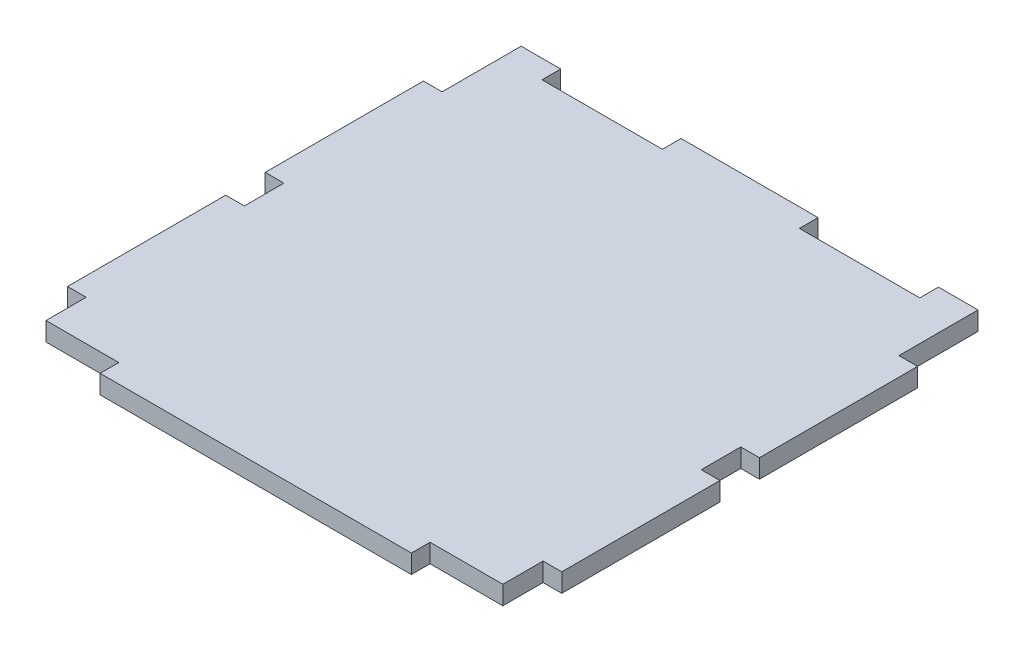
ISO-10303-21;
HEADER;
FILE_DESCRIPTION(('STEP AP214'),'2;1');
FILE_NAME('part.step','',(''),(''),'','','');
FILE_SCHEMA(('AUTOMOTIVE_DESIGN { 1 0 10303 214 1 1 1 1 }'));
ENDSEC;
DATA;
#1=APPLICATION_CONTEXT('core data for automotive mechanical design processes');
#2=APPLICATION_PROTOCOL_DEFINITION('international standard','automotive_design',2000,#1);
#3=PRODUCT_CONTEXT('',#1,'mechanical');
#4=PRODUCT('Part','Part','',(#3));
#5=PRODUCT_RELATED_PRODUCT_CATEGORY('part','',(#4));
#6=PRODUCT_DEFINITION_FORMATION('','',#4);
#7=PRODUCT_DEFINITION_CONTEXT('part definition',#1,'design');
#8=PRODUCT_DEFINITION('design','',#6,#7);
#9=PRODUCT_DEFINITION_SHAPE('','',#8);
#10=(LENGTH_UNIT() NAMED_UNIT(*) SI_UNIT(.MILLI.,.METRE.));
#11=(NAMED_UNIT(*) PLANE_ANGLE_UNIT() SI_UNIT($,.RADIAN.));
#12=(NAMED_UNIT(*) SI_UNIT($,.STERADIAN.) SOLID_ANGLE_UNIT());
#13=UNCERTAINTY_MEASURE_WITH_UNIT(LENGTH_MEASURE(1.E-05),#10,'distance_accuracy_value','');
#14=(GEOMETRIC_REPRESENTATION_CONTEXT(3) GLOBAL_UNCERTAINTY_ASSIGNED_CONTEXT((#13)) GLOBAL_UNIT_ASSIGNED_CONTEXT((#10,
#11,#12)) REPRESENTATION_CONTEXT('',''));
#15=CARTESIAN_POINT('',(0.,0.,0.));
#16=DIRECTION('',(0.,0.,1.));
#17=DIRECTION('',(1.,0.,0.));
#18=AXIS2_PLACEMENT_3D('',#15,#16,#17);
#19=CARTESIAN_POINT('',(0.,3.,35.155));
#20=DIRECTION('',(0.,0.,1.));
#21=DIRECTION('',(1.,0.,0.));
#22=AXIS2_PLACEMENT_3D('',#19,#20,#21);
#23=PLANE('',#22);
#24=DIRECTION('',(-1.,0.,0.));
#25=VECTOR('',#24,1.);
#26=CARTESIAN_POINT('',(0.,0.,35.155));
#27=LINE('',#26,#25);
#28=CARTESIAN_POINT('',(36.685,0.,35.155));
#29=VERTEX_POINT('',#28);
#30=CARTESIAN_POINT('',(24.995,0.,35.155));
#31=VERTEX_POINT('',#30);
#32=EDGE_CURVE('E271',#29,#31,#27,.T.);
#33=ORIENTED_EDGE('',*,*,#32,.F.);
#34=DIRECTION('',(0.,-1.,0.));
#35=VECTOR('',#34,1.);
#36=CARTESIAN_POINT('',(36.685,3.,35.155));
#37=LINE('',#36,#35);
#38=CARTESIAN_POINT('',(36.685,3.,35.155));
#39=VERTEX_POINT('',#38);
#40=EDGE_CURVE('E11',#39,#29,#37,.T.);
#41=ORIENTED_EDGE('',*,*,#40,.F.);
#42=DIRECTION('',(-1.,0.,0.));
#43=VECTOR('',#42,1.);
#44=CARTESIAN_POINT('',(0.,3.,35.155));
#45=LINE('',#44,#43);
#46=CARTESIAN_POINT('',(24.995,3.,35.155));
#47=VERTEX_POINT('',#46);
#48=EDGE_CURVE('E351',#39,#47,#45,.T.);
#49=ORIENTED_EDGE('',*,*,#48,.T.);
#50=DIRECTION('',(0.,-1.,0.));
#51=VECTOR('',#50,1.);
#52=CARTESIAN_POINT('',(24.995,3.,35.155));
#53=LINE('',#52,#51);
#54=EDGE_CURVE('E48',#47,#31,#53,.T.);
#55=ORIENTED_EDGE('',*,*,#54,.T.);
#56=EDGE_LOOP('',(#33,#41,#49,#55));
#57=FACE_BOUND('',#56,.T.);
#58=ADVANCED_FACE('F32',(#57),#23,.T.);
#59=CARTESIAN_POINT('',(36.685,3.,0.));
#60=DIRECTION('',(-1.,0.,0.));
#61=DIRECTION('',(0.,0.,1.));
#62=AXIS2_PLACEMENT_3D('',#59,#60,#61);
#63=PLANE('',#62);
#64=DIRECTION('',(0.,0.,-1.));
#65=VECTOR('',#64,1.);
#66=CARTESIAN_POINT('',(36.685,0.,0.));
#67=LINE('',#66,#65);
#68=CARTESIAN_POINT('',(36.685,0.,28.695));
#69=VERTEX_POINT('',#68);
#70=EDGE_CURVE('E273',#29,#69,#67,.T.);
#71=ORIENTED_EDGE('',*,*,#70,.T.);
#72=DIRECTION('',(0.,-1.,0.));
#73=VECTOR('',#72,1.);
#74=CARTESIAN_POINT('',(36.685,3.,28.695));
#75=LINE('',#74,#73);
#76=CARTESIAN_POINT('',(36.685,3.,28.695));
#77=VERTEX_POINT('',#76);
#78=EDGE_CURVE('E40',#77,#69,#75,.T.);
#79=ORIENTED_EDGE('',*,*,#78,.F.);
#80=DIRECTION('',(0.,0.,-1.));
#81=VECTOR('',#80,1.);
#82=CARTESIAN_POINT('',(36.685,3.,0.));
#83=LINE('',#82,#81);
#84=EDGE_CURVE('E890',#39,#77,#83,.T.);
#85=ORIENTED_EDGE('',*,*,#84,.F.);
#86=ORIENTED_EDGE('',*,*,#40,.T.);
#87=EDGE_LOOP('',(#71,#79,#85,#86));
#88=FACE_BOUND('',#87,.T.);
#89=ADVANCED_FACE('F526',(#88),#63,.F.);
#90=CARTESIAN_POINT('',(0.,3.,28.695));
#91=DIRECTION('',(0.,0.,-1.));
#92=DIRECTION('',(-1.,0.,0.));
#93=AXIS2_PLACEMENT_3D('',#90,#91,#92);
#94=PLANE('',#93);
#95=DIRECTION('',(1.,0.,0.));
#96=VECTOR('',#95,1.);
#97=CARTESIAN_POINT('',(0.,0.,28.695));
#98=LINE('',#97,#96);
#99=CARTESIAN_POINT('',(39.685,0.,28.695));
#100=VERTEX_POINT('',#99);
#101=EDGE_CURVE('E275',#69,#100,#98,.T.);
#102=ORIENTED_EDGE('',*,*,#101,.T.);
#103=DIRECTION('',(0.,-1.,0.));
#104=VECTOR('',#103,1.);
#105=CARTESIAN_POINT('',(39.685,3.,28.695));
#106=LINE('',#105,#104);
#107=CARTESIAN_POINT('',(39.685,3.,28.695));
#108=VERTEX_POINT('',#107);
#109=EDGE_CURVE('E414',#108,#100,#106,.T.);
#110=ORIENTED_EDGE('',*,*,#109,.F.);
#111=DIRECTION('',(1.,0.,0.));
#112=VECTOR('',#111,1.);
#113=CARTESIAN_POINT('',(0.,3.,28.695));
#114=LINE('',#113,#112);
#115=EDGE_CURVE('E423',#77,#108,#114,.T.);
#116=ORIENTED_EDGE('',*,*,#115,.F.);
#117=ORIENTED_EDGE('',*,*,#78,.T.);
#118=EDGE_LOOP('',(#102,#110,#116,#117));
#119=FACE_BOUND('',#118,.T.);
#120=ADVANCED_FACE('F421',(#119),#94,.F.);
#121=CARTESIAN_POINT('',(39.685,3.,0.));
#122=DIRECTION('',(-1.,0.,0.));
#123=DIRECTION('',(0.,0.,1.));
#124=AXIS2_PLACEMENT_3D('',#121,#122,#123);
#125=PLANE('',#124);
#126=DIRECTION('',(0.,0.,-1.));
#127=VECTOR('',#126,1.);
#128=CARTESIAN_POINT('',(39.685,0.,0.));
#129=LINE('',#128,#127);
#130=CARTESIAN_POINT('',(39.685,0.,3.29499999999999));
#131=VERTEX_POINT('',#130);
#132=EDGE_CURVE('E277',#100,#131,#129,.T.);
#133=ORIENTED_EDGE('',*,*,#132,.T.);
#134=DIRECTION('',(0.,-1.,0.));
#135=VECTOR('',#134,1.);
#136=CARTESIAN_POINT('',(39.685,3.,3.29499999999999));
#137=LINE('',#136,#135);
#138=CARTESIAN_POINT('',(39.685,3.,3.29499999999999));
#139=VERTEX_POINT('',#138);
#140=EDGE_CURVE('E411',#139,#131,#137,.T.);
#141=ORIENTED_EDGE('',*,*,#140,.F.);
#142=DIRECTION('',(0.,0.,-1.));
#143=VECTOR('',#142,1.);
#144=CARTESIAN_POINT('',(39.685,3.,0.));
#145=LINE('',#144,#143);
#146=EDGE_CURVE('E442',#108,#139,#145,.T.);
#147=ORIENTED_EDGE('',*,*,#146,.F.);
#148=ORIENTED_EDGE('',*,*,#109,.T.);
#149=EDGE_LOOP('',(#133,#141,#147,#148));
#150=FACE_BOUND('',#149,.T.);
#151=ADVANCED_FACE('F433',(#150),#125,.F.);
#152=CARTESIAN_POINT('',(0.,3.,3.29499999999998));
#153=DIRECTION('',(0.,0.,1.));
#154=DIRECTION('',(1.,0.,0.));
#155=AXIS2_PLACEMENT_3D('',#152,#153,#154);
#156=PLANE('',#155);
#157=DIRECTION('',(-1.,0.,0.));
#158=VECTOR('',#157,1.);
#159=CARTESIAN_POINT('',(0.,0.,3.29499999999998));
#160=LINE('',#159,#158);
#161=CARTESIAN_POINT('',(36.685,0.,3.29499999999999));
#162=VERTEX_POINT('',#161);
#163=EDGE_CURVE('E279',#131,#162,#160,.T.);
#164=ORIENTED_EDGE('',*,*,#163,.T.);
#165=DIRECTION('',(0.,-1.,0.));
#166=VECTOR('',#165,1.);
#167=CARTESIAN_POINT('',(36.685,3.,3.29499999999999));
#168=LINE('',#167,#166);
#169=CARTESIAN_POINT('',(36.685,3.,3.29499999999999));
#170=VERTEX_POINT('',#169);
#171=EDGE_CURVE('E408',#170,#162,#168,.T.);
#172=ORIENTED_EDGE('',*,*,#171,.F.);
#173=DIRECTION('',(-1.,0.,0.));
#174=VECTOR('',#173,1.);
#175=CARTESIAN_POINT('',(0.,3.,3.29499999999998));
#176=LINE('',#175,#174);
#177=EDGE_CURVE('E439',#139,#170,#176,.T.);
#178=ORIENTED_EDGE('',*,*,#177,.F.);
#179=ORIENTED_EDGE('',*,*,#140,.T.);
#180=EDGE_LOOP('',(#164,#172,#178,#179));
#181=FACE_BOUND('',#180,.T.);
#182=ADVANCED_FACE('F437',(#181),#156,.F.);
#183=CARTESIAN_POINT('',(36.685,3.,0.));
#184=DIRECTION('',(-1.,0.,0.));
#185=DIRECTION('',(0.,0.,1.));
#186=AXIS2_PLACEMENT_3D('',#183,#184,#185);
#187=PLANE('',#186);
#188=DIRECTION('',(0.,0.,-1.));
#189=VECTOR('',#188,1.);
#190=CARTESIAN_POINT('',(36.685,0.,0.));
#191=LINE('',#190,#189);
#192=CARTESIAN_POINT('',(36.685,0.,-3.05500000000001));
#193=VERTEX_POINT('',#192);
#194=EDGE_CURVE('E281',#162,#193,#191,.T.);
#195=ORIENTED_EDGE('',*,*,#194,.T.);
#196=DIRECTION('',(0.,-1.,0.));
#197=VECTOR('',#196,1.);
#198=CARTESIAN_POINT('',(36.685,3.,-3.05500000000001));
#199=LINE('',#198,#197);
#200=CARTESIAN_POINT('',(36.685,3.,-3.05500000000001));
#201=VERTEX_POINT('',#200);
#202=EDGE_CURVE('E405',#201,#193,#199,.T.);
#203=ORIENTED_EDGE('',*,*,#202,.F.);
#204=DIRECTION('',(0.,0.,-1.));
#205=VECTOR('',#204,1.);
#206=CARTESIAN_POINT('',(36.685,3.,0.));
#207=LINE('',#206,#205);
#208=EDGE_CURVE('E441',#170,#201,#207,.T.);
#209=ORIENTED_EDGE('',*,*,#208,.F.);
#210=ORIENTED_EDGE('',*,*,#171,.T.);
#211=EDGE_LOOP('',(#195,#203,#209,#210));
#212=FACE_BOUND('',#211,.T.);
#213=ADVANCED_FACE('F785',(#212),#187,.F.);
#214=CARTESIAN_POINT('',(0.,3.,-3.05500000000001));
#215=DIRECTION('',(0.,0.,-1.));
#216=DIRECTION('',(-1.,0.,0.));
#217=AXIS2_PLACEMENT_3D('',#214,#215,#216);
#218=PLANE('',#217);
#219=DIRECTION('',(1.,0.,0.));
#220=VECTOR('',#219,1.);
#221=CARTESIAN_POINT('',(0.,0.,-3.05500000000001));
#222=LINE('',#221,#220);
#223=CARTESIAN_POINT('',(39.685,0.,-3.05500000000001));
#224=VERTEX_POINT('',#223);
#225=EDGE_CURVE('E283',#193,#224,#222,.T.);
#226=ORIENTED_EDGE('',*,*,#225,.T.);
#227=DIRECTION('',(0.,-1.,0.));
#228=VECTOR('',#227,1.);
#229=CARTESIAN_POINT('',(39.685,3.,-3.05500000000001));
#230=LINE('',#229,#228);
#231=CARTESIAN_POINT('',(39.685,3.,-3.05500000000001));
#232=VERTEX_POINT('',#231);
#233=EDGE_CURVE('E402',#232,#224,#230,.T.);
#234=ORIENTED_EDGE('',*,*,#233,.F.);
#235=DIRECTION('',(1.,0.,0.));
#236=VECTOR('',#235,1.);
#237=CARTESIAN_POINT('',(0.,3.,-3.05500000000001));
#238=LINE('',#237,#236);
#239=EDGE_CURVE('E444',#201,#232,#238,.T.);
#240=ORIENTED_EDGE('',*,*,#239,.F.);
#241=ORIENTED_EDGE('',*,*,#202,.T.);
#242=EDGE_LOOP('',(#226,#234,#240,#241));
#243=FACE_BOUND('',#242,.T.);
#244=ADVANCED_FACE('F775',(#243),#218,.F.);
#245=CARTESIAN_POINT('',(39.685,3.,0.));
#246=DIRECTION('',(-1.,0.,0.));
#247=DIRECTION('',(0.,0.,1.));
#248=AXIS2_PLACEMENT_3D('',#245,#246,#247);
#249=PLANE('',#248);
#250=DIRECTION('',(0.,0.,-1.));
#251=VECTOR('',#250,1.);
#252=CARTESIAN_POINT('',(39.685,0.,0.));
#253=LINE('',#252,#251);
#254=CARTESIAN_POINT('',(39.685,0.,-28.455));
#255=VERTEX_POINT('',#254);
#256=EDGE_CURVE('E285',#224,#255,#253,.T.);
#257=ORIENTED_EDGE('',*,*,#256,.T.);
#258=DIRECTION('',(0.,-1.,0.));
#259=VECTOR('',#258,1.);
#260=CARTESIAN_POINT('',(39.685,3.,-28.455));
#261=LINE('',#260,#259);
#262=CARTESIAN_POINT('',(39.685,3.,-28.455));
#263=VERTEX_POINT('',#262);
#264=EDGE_CURVE('E399',#263,#255,#261,.T.);
#265=ORIENTED_EDGE('',*,*,#264,.F.);
#266=DIRECTION('',(0.,0.,-1.));
#267=VECTOR('',#266,1.);
#268=CARTESIAN_POINT('',(39.685,3.,0.));
#269=LINE('',#268,#267);
#270=EDGE_CURVE('E450',#232,#263,#269,.T.);
#271=ORIENTED_EDGE('',*,*,#270,.F.);
#272=ORIENTED_EDGE('',*,*,#233,.T.);
#273=EDGE_LOOP('',(#257,#265,#271,#272));
#274=FACE_BOUND('',#273,.T.);
#275=ADVANCED_FACE('F765',(#274),#249,.F.);
#276=CARTESIAN_POINT('',(0.,3.,-28.455));
#277=DIRECTION('',(0.,0.,1.));
#278=DIRECTION('',(1.,0.,0.));
#279=AXIS2_PLACEMENT_3D('',#276,#277,#278);
#280=PLANE('',#279);
#281=DIRECTION('',(-1.,0.,0.));
#282=VECTOR('',#281,1.);
#283=CARTESIAN_POINT('',(0.,0.,-28.455));
#284=LINE('',#283,#282);
#285=CARTESIAN_POINT('',(36.685,0.,-28.455));
#286=VERTEX_POINT('',#285);
#287=EDGE_CURVE('E287',#255,#286,#284,.T.);
#288=ORIENTED_EDGE('',*,*,#287,.T.);
#289=DIRECTION('',(0.,-1.,0.));
#290=VECTOR('',#289,1.);
#291=CARTESIAN_POINT('',(36.685,3.,-28.455));
#292=LINE('',#291,#290);
#293=CARTESIAN_POINT('',(36.685,3.,-28.455));
#294=VERTEX_POINT('',#293);
#295=EDGE_CURVE('E396',#294,#286,#292,.T.);
#296=ORIENTED_EDGE('',*,*,#295,.F.);
#297=DIRECTION('',(-1.,0.,0.));
#298=VECTOR('',#297,1.);
#299=CARTESIAN_POINT('',(0.,3.,-28.455));
#300=LINE('',#299,#298);
#301=EDGE_CURVE('E452',#263,#294,#300,.T.);
#302=ORIENTED_EDGE('',*,*,#301,.F.);
#303=ORIENTED_EDGE('',*,*,#264,.T.);
#304=EDGE_LOOP('',(#288,#296,#302,#303));
#305=FACE_BOUND('',#304,.T.);
#306=ADVANCED_FACE('F754',(#305),#280,.F.);
#307=CARTESIAN_POINT('',(36.685,3.,0.));
#308=DIRECTION('',(-1.,0.,0.));
#309=DIRECTION('',(0.,0.,1.));
#310=AXIS2_PLACEMENT_3D('',#307,#308,#309);
#311=PLANE('',#310);
#312=DIRECTION('',(0.,0.,-1.));
#313=VECTOR('',#312,1.);
#314=CARTESIAN_POINT('',(36.685,0.,0.));
#315=LINE('',#314,#313);
#316=CARTESIAN_POINT('',(36.685,0.,-41.155));
#317=VERTEX_POINT('',#316);
#318=EDGE_CURVE('E289',#286,#317,#315,.T.);
#319=ORIENTED_EDGE('',*,*,#318,.T.);
#320=DIRECTION('',(0.,-1.,0.));
#321=VECTOR('',#320,1.);
#322=CARTESIAN_POINT('',(36.685,3.,-41.155));
#323=LINE('',#322,#321);
#324=CARTESIAN_POINT('',(36.685,3.,-41.155));
#325=VERTEX_POINT('',#324);
#326=EDGE_CURVE('E394',#325,#317,#323,.T.);
#327=ORIENTED_EDGE('',*,*,#326,.F.);
#328=DIRECTION('',(0.,0.,-1.));
#329=VECTOR('',#328,1.);
#330=CARTESIAN_POINT('',(36.685,3.,0.));
#331=LINE('',#330,#329);
#332=EDGE_CURVE('E454',#294,#325,#331,.T.);
#333=ORIENTED_EDGE('',*,*,#332,.F.);
#334=ORIENTED_EDGE('',*,*,#295,.T.);
#335=EDGE_LOOP('',(#319,#327,#333,#334));
#336=FACE_BOUND('',#335,.T.);
#337=ADVANCED_FACE('F743',(#336),#311,.F.);
#338=CARTESIAN_POINT('',(0.,3.,-41.155));
#339=DIRECTION('',(0.,0.,-1.));
#340=DIRECTION('',(-1.,0.,0.));
#341=AXIS2_PLACEMENT_3D('',#338,#339,#340);
#342=PLANE('',#341);
#343=DIRECTION('',(1.,0.,0.));
#344=VECTOR('',#343,1.);
#345=CARTESIAN_POINT('',(0.,0.,-41.155));
#346=LINE('',#345,#344);
#347=CARTESIAN_POINT('',(30.335,0.,-41.155));
#348=VERTEX_POINT('',#347);
#349=EDGE_CURVE('E292',#348,#317,#346,.T.);
#350=ORIENTED_EDGE('',*,*,#349,.F.);
#351=DIRECTION('',(0.,-1.,0.));
#352=VECTOR('',#351,1.);
#353=CARTESIAN_POINT('',(30.335,3.,-41.155));
#354=LINE('',#353,#352);
#355=CARTESIAN_POINT('',(30.335,3.,-41.155));
#356=VERTEX_POINT('',#355);
#357=EDGE_CURVE('E392',#356,#348,#354,.T.);
#358=ORIENTED_EDGE('',*,*,#357,.F.);
#359=DIRECTION('',(1.,0.,0.));
#360=VECTOR('',#359,1.);
#361=CARTESIAN_POINT('',(0.,3.,-41.155));
#362=LINE('',#361,#360);
#363=EDGE_CURVE('E456',#356,#325,#362,.T.);
#364=ORIENTED_EDGE('',*,*,#363,.T.);
#365=ORIENTED_EDGE('',*,*,#326,.T.);
#366=EDGE_LOOP('',(#350,#358,#364,#365));
#367=FACE_BOUND('',#366,.T.);
#368=ADVANCED_FACE('F733',(#367),#342,.T.);
#369=CARTESIAN_POINT('',(30.335,3.,0.));
#370=DIRECTION('',(-1.,0.,0.));
#371=DIRECTION('',(0.,0.,1.));
#372=AXIS2_PLACEMENT_3D('',#369,#370,#371);
#373=PLANE('',#372);
#374=DIRECTION('',(0.,0.,-1.));
#375=VECTOR('',#374,1.);
#376=CARTESIAN_POINT('',(30.335,0.,0.));
#377=LINE('',#376,#375);
#378=CARTESIAN_POINT('',(30.335,0.,-38.155));
#379=VERTEX_POINT('',#378);
#380=EDGE_CURVE('E295',#379,#348,#377,.T.);
#381=ORIENTED_EDGE('',*,*,#380,.F.);
#382=DIRECTION('',(0.,-1.,0.));
#383=VECTOR('',#382,1.);
#384=CARTESIAN_POINT('',(30.335,3.,-38.155));
#385=LINE('',#384,#383);
#386=CARTESIAN_POINT('',(30.335,3.,-38.155));
#387=VERTEX_POINT('',#386);
#388=EDGE_CURVE('E390',#387,#379,#385,.T.);
#389=ORIENTED_EDGE('',*,*,#388,.F.);
#390=DIRECTION('',(0.,0.,-1.));
#391=VECTOR('',#390,1.);
#392=CARTESIAN_POINT('',(30.335,3.,0.));
#393=LINE('',#392,#391);
#394=EDGE_CURVE('E459',#387,#356,#393,.T.);
#395=ORIENTED_EDGE('',*,*,#394,.T.);
#396=ORIENTED_EDGE('',*,*,#357,.T.);
#397=EDGE_LOOP('',(#381,#389,#395,#396));
#398=FACE_BOUND('',#397,.T.);
#399=ADVANCED_FACE('F723',(#398),#373,.T.);
#400=CARTESIAN_POINT('',(0.,3.,-38.155));
#401=DIRECTION('',(0.,0.,1.));
#402=DIRECTION('',(1.,0.,0.));
#403=AXIS2_PLACEMENT_3D('',#400,#401,#402);
#404=PLANE('',#403);
#405=DIRECTION('',(-1.,0.,0.));
#406=VECTOR('',#405,1.);
#407=CARTESIAN_POINT('',(0.,0.,-38.155));
#408=LINE('',#407,#406);
#409=CARTESIAN_POINT('',(11.,0.,-38.155));
#410=VERTEX_POINT('',#409);
#411=EDGE_CURVE('E298',#379,#410,#408,.T.);
#412=ORIENTED_EDGE('',*,*,#411,.T.);
#413=DIRECTION('',(0.,-1.,0.));
#414=VECTOR('',#413,1.);
#415=CARTESIAN_POINT('',(11.,3.,-38.155));
#416=LINE('',#415,#414);
#417=CARTESIAN_POINT('',(11.,3.,-38.155));
#418=VERTEX_POINT('',#417);
#419=EDGE_CURVE('E388',#418,#410,#416,.T.);
#420=ORIENTED_EDGE('',*,*,#419,.F.);
#421=DIRECTION('',(-1.,0.,0.));
#422=VECTOR('',#421,1.);
#423=CARTESIAN_POINT('',(0.,3.,-38.155));
#424=LINE('',#423,#422);
#425=EDGE_CURVE('E462',#387,#418,#424,.T.);
#426=ORIENTED_EDGE('',*,*,#425,.F.);
#427=ORIENTED_EDGE('',*,*,#388,.T.);
#428=EDGE_LOOP('',(#412,#420,#426,#427));
#429=FACE_BOUND('',#428,.T.);
#430=ADVANCED_FACE('F713',(#429),#404,.F.);
#431=CARTESIAN_POINT('',(11.,3.,0.));
#432=DIRECTION('',(1.,0.,0.));
#433=DIRECTION('',(0.,0.,-1.));
#434=AXIS2_PLACEMENT_3D('',#431,#432,#433);
#435=PLANE('',#434);
#436=DIRECTION('',(0.,0.,1.));
#437=VECTOR('',#436,1.);
#438=CARTESIAN_POINT('',(11.,0.,0.));
#439=LINE('',#438,#437);
#440=CARTESIAN_POINT('',(11.,0.,-41.155));
#441=VERTEX_POINT('',#440);
#442=EDGE_CURVE('E301',#441,#410,#439,.T.);
#443=ORIENTED_EDGE('',*,*,#442,.F.);
#444=DIRECTION('',(0.,-1.,0.));
#445=VECTOR('',#444,1.);
#446=CARTESIAN_POINT('',(11.,3.,-41.155));
#447=LINE('',#446,#445);
#448=CARTESIAN_POINT('',(11.,3.,-41.155));
#449=VERTEX_POINT('',#448);
#450=EDGE_CURVE('E386',#449,#441,#447,.T.);
#451=ORIENTED_EDGE('',*,*,#450,.F.);
#452=DIRECTION('',(0.,0.,1.));
#453=VECTOR('',#452,1.);
#454=CARTESIAN_POINT('',(11.,3.,0.));
#455=LINE('',#454,#453);
#456=EDGE_CURVE('E464',#449,#418,#455,.T.);
#457=ORIENTED_EDGE('',*,*,#456,.T.);
#458=ORIENTED_EDGE('',*,*,#419,.T.);
#459=EDGE_LOOP('',(#443,#451,#457,#458));
#460=FACE_BOUND('',#459,.T.);
#461=ADVANCED_FACE('F703',(#460),#435,.T.);
#462=CARTESIAN_POINT('',(0.,3.,-41.155));
#463=DIRECTION('',(0.,0.,-1.));
#464=DIRECTION('',(-1.,0.,0.));
#465=AXIS2_PLACEMENT_3D('',#462,#463,#464);
#466=PLANE('',#465);
#467=DIRECTION('',(1.,0.,0.));
#468=VECTOR('',#467,1.);
#469=CARTESIAN_POINT('',(0.,0.,-41.155));
#470=LINE('',#469,#468);
#471=CARTESIAN_POINT('',(-11.,0.,-41.155));
#472=VERTEX_POINT('',#471);
#473=EDGE_CURVE('E304',#472,#441,#470,.T.);
#474=ORIENTED_EDGE('',*,*,#473,.F.);
#475=DIRECTION('',(0.,-1.,0.));
#476=VECTOR('',#475,1.);
#477=CARTESIAN_POINT('',(-11.,3.,-41.155));
#478=LINE('',#477,#476);
#479=CARTESIAN_POINT('',(-11.,3.,-41.155));
#480=VERTEX_POINT('',#479);
#481=EDGE_CURVE('E384',#480,#472,#478,.T.);
#482=ORIENTED_EDGE('',*,*,#481,.F.);
#483=DIRECTION('',(1.,0.,0.));
#484=VECTOR('',#483,1.);
#485=CARTESIAN_POINT('',(0.,3.,-41.155));
#486=LINE('',#485,#484);
#487=EDGE_CURVE('E467',#480,#449,#486,.T.);
#488=ORIENTED_EDGE('',*,*,#487,.T.);
#489=ORIENTED_EDGE('',*,*,#450,.T.);
#490=EDGE_LOOP('',(#474,#482,#488,#489));
#491=FACE_BOUND('',#490,.T.);
#492=ADVANCED_FACE('F693',(#491),#466,.T.);
#493=CARTESIAN_POINT('',(-11.,3.,0.));
#494=DIRECTION('',(1.,0.,0.));
#495=DIRECTION('',(0.,0.,-1.));
#496=AXIS2_PLACEMENT_3D('',#493,#494,#495);
#497=PLANE('',#496);
#498=DIRECTION('',(0.,0.,1.));
#499=VECTOR('',#498,1.);
#500=CARTESIAN_POINT('',(-11.,0.,0.));
#501=LINE('',#500,#499);
#502=CARTESIAN_POINT('',(-11.,0.,-38.155));
#503=VERTEX_POINT('',#502);
#504=EDGE_CURVE('E307',#472,#503,#501,.T.);
#505=ORIENTED_EDGE('',*,*,#504,.T.);
#506=DIRECTION('',(0.,-1.,0.));
#507=VECTOR('',#506,1.);
#508=CARTESIAN_POINT('',(-11.,3.,-38.155));
#509=LINE('',#508,#507);
#510=CARTESIAN_POINT('',(-11.,3.,-38.155));
#511=VERTEX_POINT('',#510);
#512=EDGE_CURVE('E381',#511,#503,#509,.T.);
#513=ORIENTED_EDGE('',*,*,#512,.F.);
#514=DIRECTION('',(0.,0.,1.));
#515=VECTOR('',#514,1.);
#516=CARTESIAN_POINT('',(-11.,3.,0.));
#517=LINE('',#516,#515);
#518=EDGE_CURVE('E470',#480,#511,#517,.T.);
#519=ORIENTED_EDGE('',*,*,#518,.F.);
#520=ORIENTED_EDGE('',*,*,#481,.T.);
#521=EDGE_LOOP('',(#505,#513,#519,#520));
#522=FACE_BOUND('',#521,.T.);
#523=ADVANCED_FACE('F683',(#522),#497,.F.);
#524=CARTESIAN_POINT('',(0.,3.,-38.155));
#525=DIRECTION('',(0.,0.,1.));
#526=DIRECTION('',(1.,0.,0.));
#527=AXIS2_PLACEMENT_3D('',#524,#525,#526);
#528=PLANE('',#527);
#529=DIRECTION('',(-1.,0.,0.));
#530=VECTOR('',#529,1.);
#531=CARTESIAN_POINT('',(0.,0.,-38.155));
#532=LINE('',#531,#530);
#533=CARTESIAN_POINT('',(-30.335,0.,-38.155));
#534=VERTEX_POINT('',#533);
#535=EDGE_CURVE('E309',#503,#534,#532,.T.);
#536=ORIENTED_EDGE('',*,*,#535,.T.);
#537=DIRECTION('',(0.,-1.,0.));
#538=VECTOR('',#537,1.);
#539=CARTESIAN_POINT('',(-30.335,3.,-38.155));
#540=LINE('',#539,#538);
#541=CARTESIAN_POINT('',(-30.335,3.,-38.155));
#542=VERTEX_POINT('',#541);
#543=EDGE_CURVE('E378',#542,#534,#540,.T.);
#544=ORIENTED_EDGE('',*,*,#543,.F.);
#545=DIRECTION('',(-1.,0.,0.));
#546=VECTOR('',#545,1.);
#547=CARTESIAN_POINT('',(0.,3.,-38.155));
#548=LINE('',#547,#546);
#549=EDGE_CURVE('E472',#511,#542,#548,.T.);
#550=ORIENTED_EDGE('',*,*,#549,.F.);
#551=ORIENTED_EDGE('',*,*,#512,.T.);
#552=EDGE_LOOP('',(#536,#544,#550,#551));
#553=FACE_BOUND('',#552,.T.);
#554=ADVANCED_FACE('F673',(#553),#528,.F.);
#555=CARTESIAN_POINT('',(-30.335,3.,0.));
#556=DIRECTION('',(-1.,0.,0.));
#557=DIRECTION('',(0.,0.,1.));
#558=AXIS2_PLACEMENT_3D('',#555,#556,#557);
#559=PLANE('',#558);
#560=DIRECTION('',(0.,0.,-1.));
#561=VECTOR('',#560,1.);
#562=CARTESIAN_POINT('',(-30.335,0.,0.));
#563=LINE('',#562,#561);
#564=CARTESIAN_POINT('',(-30.335,0.,-41.155));
#565=VERTEX_POINT('',#564);
#566=EDGE_CURVE('E311',#534,#565,#563,.T.);
#567=ORIENTED_EDGE('',*,*,#566,.T.);
#568=DIRECTION('',(0.,-1.,0.));
#569=VECTOR('',#568,1.);
#570=CARTESIAN_POINT('',(-30.335,3.,-41.155));
#571=LINE('',#570,#569);
#572=CARTESIAN_POINT('',(-30.335,3.,-41.155));
#573=VERTEX_POINT('',#572);
#574=EDGE_CURVE('E375',#573,#565,#571,.T.);
#575=ORIENTED_EDGE('',*,*,#574,.F.);
#576=DIRECTION('',(0.,0.,-1.));
#577=VECTOR('',#576,1.);
#578=CARTESIAN_POINT('',(-30.335,3.,0.));
#579=LINE('',#578,#577);
#580=EDGE_CURVE('E474',#542,#573,#579,.T.);
#581=ORIENTED_EDGE('',*,*,#580,.F.);
#582=ORIENTED_EDGE('',*,*,#543,.T.);
#583=EDGE_LOOP('',(#567,#575,#581,#582));
#584=FACE_BOUND('',#583,.T.);
#585=ADVANCED_FACE('F662',(#584),#559,.F.);
#586=CARTESIAN_POINT('',(0.,3.,-41.155));
#587=DIRECTION('',(0.,0.,1.));
#588=DIRECTION('',(1.,0.,0.));
#589=AXIS2_PLACEMENT_3D('',#586,#587,#588);
#590=PLANE('',#589);
#591=DIRECTION('',(-1.,0.,0.));
#592=VECTOR('',#591,1.);
#593=CARTESIAN_POINT('',(0.,0.,-41.155));
#594=LINE('',#593,#592);
#595=CARTESIAN_POINT('',(-36.685,0.,-41.155));
#596=VERTEX_POINT('',#595);
#597=EDGE_CURVE('E313',#565,#596,#594,.T.);
#598=ORIENTED_EDGE('',*,*,#597,.T.);
#599=DIRECTION('',(0.,-1.,0.));
#600=VECTOR('',#599,1.);
#601=CARTESIAN_POINT('',(-36.685,3.,-41.155));
#602=LINE('',#601,#600);
#603=CARTESIAN_POINT('',(-36.685,3.,-41.155));
#604=VERTEX_POINT('',#603);
#605=EDGE_CURVE('E373',#604,#596,#602,.T.);
#606=ORIENTED_EDGE('',*,*,#605,.F.);
#607=DIRECTION('',(-1.,0.,0.));
#608=VECTOR('',#607,1.);
#609=CARTESIAN_POINT('',(0.,3.,-41.155));
#610=LINE('',#609,#608);
#611=EDGE_CURVE('E476',#573,#604,#610,.T.);
#612=ORIENTED_EDGE('',*,*,#611,.F.);
#613=ORIENTED_EDGE('',*,*,#574,.T.);
#614=EDGE_LOOP('',(#598,#606,#612,#613));
#615=FACE_BOUND('',#614,.T.);
#616=ADVANCED_FACE('F651',(#615),#590,.F.);
#617=CARTESIAN_POINT('',(-36.685,3.,0.));
#618=DIRECTION('',(-1.,0.,0.));
#619=DIRECTION('',(0.,0.,1.));
#620=AXIS2_PLACEMENT_3D('',#617,#618,#619);
#621=PLANE('',#620);
#622=DIRECTION('',(0.,0.,-1.));
#623=VECTOR('',#622,1.);
#624=CARTESIAN_POINT('',(-36.685,0.,0.));
#625=LINE('',#624,#623);
#626=CARTESIAN_POINT('',(-36.685,0.,-28.455));
#627=VERTEX_POINT('',#626);
#628=EDGE_CURVE('E316',#627,#596,#625,.T.);
#629=ORIENTED_EDGE('',*,*,#628,.F.);
#630=DIRECTION('',(0.,-1.,0.));
#631=VECTOR('',#630,1.);
#632=CARTESIAN_POINT('',(-36.685,3.,-28.455));
#633=LINE('',#632,#631);
#634=CARTESIAN_POINT('',(-36.685,3.,-28.455));
#635=VERTEX_POINT('',#634);
#636=EDGE_CURVE('E371',#635,#627,#633,.T.);
#637=ORIENTED_EDGE('',*,*,#636,.F.);
#638=DIRECTION('',(0.,0.,-1.));
#639=VECTOR('',#638,1.);
#640=CARTESIAN_POINT('',(-36.685,3.,0.));
#641=LINE('',#640,#639);
#642=EDGE_CURVE('E478',#635,#604,#641,.T.);
#643=ORIENTED_EDGE('',*,*,#642,.T.);
#644=ORIENTED_EDGE('',*,*,#605,.T.);
#645=EDGE_LOOP('',(#629,#637,#643,#644));
#646=FACE_BOUND('',#645,.T.);
#647=ADVANCED_FACE('F641',(#646),#621,.T.);
#648=CARTESIAN_POINT('',(0.,3.,-28.455));
#649=DIRECTION('',(0.,0.,-1.));
#650=DIRECTION('',(-1.,0.,0.));
#651=AXIS2_PLACEMENT_3D('',#648,#649,#650);
#652=PLANE('',#651);
#653=DIRECTION('',(1.,0.,0.));
#654=VECTOR('',#653,1.);
#655=CARTESIAN_POINT('',(0.,0.,-28.455));
#656=LINE('',#655,#654);
#657=CARTESIAN_POINT('',(-39.685,0.,-28.455));
#658=VERTEX_POINT('',#657);
#659=EDGE_CURVE('E319',#658,#627,#656,.T.);
#660=ORIENTED_EDGE('',*,*,#659,.F.);
#661=DIRECTION('',(0.,-1.,0.));
#662=VECTOR('',#661,1.);
#663=CARTESIAN_POINT('',(-39.685,3.,-28.455));
#664=LINE('',#663,#662);
#665=CARTESIAN_POINT('',(-39.685,3.,-28.455));
#666=VERTEX_POINT('',#665);
#667=EDGE_CURVE('E369',#666,#658,#664,.T.);
#668=ORIENTED_EDGE('',*,*,#667,.F.);
#669=DIRECTION('',(1.,0.,0.));
#670=VECTOR('',#669,1.);
#671=CARTESIAN_POINT('',(0.,3.,-28.455));
#672=LINE('',#671,#670);
#673=EDGE_CURVE('E481',#666,#635,#672,.T.);
#674=ORIENTED_EDGE('',*,*,#673,.T.);
#675=ORIENTED_EDGE('',*,*,#636,.T.);
#676=EDGE_LOOP('',(#660,#668,#674,#675));
#677=FACE_BOUND('',#676,.T.);
#678=ADVANCED_FACE('F631',(#677),#652,.T.);
#679=CARTESIAN_POINT('',(-39.685,3.,0.));
#680=DIRECTION('',(-1.,0.,0.));
#681=DIRECTION('',(0.,0.,1.));
#682=AXIS2_PLACEMENT_3D('',#679,#680,#681);
#683=PLANE('',#682);
#684=DIRECTION('',(0.,0.,-1.));
#685=VECTOR('',#684,1.);
#686=CARTESIAN_POINT('',(-39.685,0.,0.));
#687=LINE('',#686,#685);
#688=CARTESIAN_POINT('',(-39.685,0.,-3.055));
#689=VERTEX_POINT('',#688);
#690=EDGE_CURVE('E322',#689,#658,#687,.T.);
#691=ORIENTED_EDGE('',*,*,#690,.F.);
#692=DIRECTION('',(0.,-1.,0.));
#693=VECTOR('',#692,1.);
#694=CARTESIAN_POINT('',(-39.685,3.,-3.055));
#695=LINE('',#694,#693);
#696=CARTESIAN_POINT('',(-39.685,3.,-3.055));
#697=VERTEX_POINT('',#696);
#698=EDGE_CURVE('E367',#697,#689,#695,.T.);
#699=ORIENTED_EDGE('',*,*,#698,.F.);
#700=DIRECTION('',(0.,0.,-1.));
#701=VECTOR('',#700,1.);
#702=CARTESIAN_POINT('',(-39.685,3.,0.));
#703=LINE('',#702,#701);
#704=EDGE_CURVE('E484',#697,#666,#703,.T.);
#705=ORIENTED_EDGE('',*,*,#704,.T.);
#706=ORIENTED_EDGE('',*,*,#667,.T.);
#707=EDGE_LOOP('',(#691,#699,#705,#706));
#708=FACE_BOUND('',#707,.T.);
#709=ADVANCED_FACE('F621',(#708),#683,.T.);
#710=CARTESIAN_POINT('',(0.,3.,-3.055));
#711=DIRECTION('',(0.,0.,1.));
#712=DIRECTION('',(1.,0.,0.));
#713=AXIS2_PLACEMENT_3D('',#710,#711,#712);
#714=PLANE('',#713);
#715=DIRECTION('',(-1.,0.,0.));
#716=VECTOR('',#715,1.);
#717=CARTESIAN_POINT('',(0.,0.,-3.055));
#718=LINE('',#717,#716);
#719=CARTESIAN_POINT('',(-36.685,0.,-3.055));
#720=VERTEX_POINT('',#719);
#721=EDGE_CURVE('E325',#720,#689,#718,.T.);
#722=ORIENTED_EDGE('',*,*,#721,.F.);
#723=DIRECTION('',(0.,-1.,0.));
#724=VECTOR('',#723,1.);
#725=CARTESIAN_POINT('',(-36.685,3.,-3.055));
#726=LINE('',#725,#724);
#727=CARTESIAN_POINT('',(-36.685,3.,-3.055));
#728=VERTEX_POINT('',#727);
#729=EDGE_CURVE('E365',#728,#720,#726,.T.);
#730=ORIENTED_EDGE('',*,*,#729,.F.);
#731=DIRECTION('',(-1.,0.,0.));
#732=VECTOR('',#731,1.);
#733=CARTESIAN_POINT('',(0.,3.,-3.055));
#734=LINE('',#733,#732);
#735=EDGE_CURVE('E487',#728,#697,#734,.T.);
#736=ORIENTED_EDGE('',*,*,#735,.T.);
#737=ORIENTED_EDGE('',*,*,#698,.T.);
#738=EDGE_LOOP('',(#722,#730,#736,#737));
#739=FACE_BOUND('',#738,.T.);
#740=ADVANCED_FACE('F611',(#739),#714,.T.);
#741=CARTESIAN_POINT('',(-36.685,3.,0.));
#742=DIRECTION('',(-1.,0.,0.));
#743=DIRECTION('',(0.,0.,1.));
#744=AXIS2_PLACEMENT_3D('',#741,#742,#743);
#745=PLANE('',#744);
#746=DIRECTION('',(0.,0.,-1.));
#747=VECTOR('',#746,1.);
#748=CARTESIAN_POINT('',(-36.685,0.,0.));
#749=LINE('',#748,#747);
#750=CARTESIAN_POINT('',(-36.685,0.,3.295));
#751=VERTEX_POINT('',#750);
#752=EDGE_CURVE('E328',#751,#720,#749,.T.);
#753=ORIENTED_EDGE('',*,*,#752,.F.);
#754=DIRECTION('',(0.,-1.,0.));
#755=VECTOR('',#754,1.);
#756=CARTESIAN_POINT('',(-36.685,3.,3.295));
#757=LINE('',#756,#755);
#758=CARTESIAN_POINT('',(-36.685,3.,3.295));
#759=VERTEX_POINT('',#758);
#760=EDGE_CURVE('E363',#759,#751,#757,.T.);
#761=ORIENTED_EDGE('',*,*,#760,.F.);
#762=DIRECTION('',(0.,0.,-1.));
#763=VECTOR('',#762,1.);
#764=CARTESIAN_POINT('',(-36.685,3.,0.));
#765=LINE('',#764,#763);
#766=EDGE_CURVE('E490',#759,#728,#765,.T.);
#767=ORIENTED_EDGE('',*,*,#766,.T.);
#768=ORIENTED_EDGE('',*,*,#729,.T.);
#769=EDGE_LOOP('',(#753,#761,#767,#768));
#770=FACE_BOUND('',#769,.T.);
#771=ADVANCED_FACE('F601',(#770),#745,.T.);
#772=CARTESIAN_POINT('',(0.,3.,3.29499999999999));
#773=DIRECTION('',(0.,0.,-1.));
#774=DIRECTION('',(-1.,0.,0.));
#775=AXIS2_PLACEMENT_3D('',#772,#773,#774);
#776=PLANE('',#775);
#777=DIRECTION('',(1.,0.,0.));
#778=VECTOR('',#777,1.);
#779=CARTESIAN_POINT('',(0.,0.,3.29499999999999));
#780=LINE('',#779,#778);
#781=CARTESIAN_POINT('',(-39.685,0.,3.295));
#782=VERTEX_POINT('',#781);
#783=EDGE_CURVE('E331',#782,#751,#780,.T.);
#784=ORIENTED_EDGE('',*,*,#783,.F.);
#785=DIRECTION('',(0.,-1.,0.));
#786=VECTOR('',#785,1.);
#787=CARTESIAN_POINT('',(-39.685,3.,3.295));
#788=LINE('',#787,#786);
#789=CARTESIAN_POINT('',(-39.685,3.,3.295));
#790=VERTEX_POINT('',#789);
#791=EDGE_CURVE('E361',#790,#782,#788,.T.);
#792=ORIENTED_EDGE('',*,*,#791,.F.);
#793=DIRECTION('',(1.,0.,0.));
#794=VECTOR('',#793,1.);
#795=CARTESIAN_POINT('',(0.,3.,3.29499999999999));
#796=LINE('',#795,#794);
#797=EDGE_CURVE('E493',#790,#759,#796,.T.);
#798=ORIENTED_EDGE('',*,*,#797,.T.);
#799=ORIENTED_EDGE('',*,*,#760,.T.);
#800=EDGE_LOOP('',(#784,#792,#798,#799));
#801=FACE_BOUND('',#800,.T.);
#802=ADVANCED_FACE('F591',(#801),#776,.T.);
#803=CARTESIAN_POINT('',(-39.685,3.,0.));
#804=DIRECTION('',(-1.,0.,0.));
#805=DIRECTION('',(0.,0.,1.));
#806=AXIS2_PLACEMENT_3D('',#803,#804,#805);
#807=PLANE('',#806);
#808=DIRECTION('',(0.,0.,-1.));
#809=VECTOR('',#808,1.);
#810=CARTESIAN_POINT('',(-39.685,0.,0.));
#811=LINE('',#810,#809);
#812=CARTESIAN_POINT('',(-39.685,0.,28.695));
#813=VERTEX_POINT('',#812);
#814=EDGE_CURVE('E334',#813,#782,#811,.T.);
#815=ORIENTED_EDGE('',*,*,#814,.F.);
#816=DIRECTION('',(0.,-1.,0.));
#817=VECTOR('',#816,1.);
#818=CARTESIAN_POINT('',(-39.685,3.,28.695));
#819=LINE('',#818,#817);
#820=CARTESIAN_POINT('',(-39.685,3.,28.695));
#821=VERTEX_POINT('',#820);
#822=EDGE_CURVE('E359',#821,#813,#819,.T.);
#823=ORIENTED_EDGE('',*,*,#822,.F.);
#824=DIRECTION('',(0.,0.,-1.));
#825=VECTOR('',#824,1.);
#826=CARTESIAN_POINT('',(-39.685,3.,0.));
#827=LINE('',#826,#825);
#828=EDGE_CURVE('E496',#821,#790,#827,.T.);
#829=ORIENTED_EDGE('',*,*,#828,.T.);
#830=ORIENTED_EDGE('',*,*,#791,.T.);
#831=EDGE_LOOP('',(#815,#823,#829,#830));
#832=FACE_BOUND('',#831,.T.);
#833=ADVANCED_FACE('F582',(#832),#807,.T.);
#834=CARTESIAN_POINT('',(0.,3.,28.695));
#835=DIRECTION('',(0.,0.,1.));
#836=DIRECTION('',(1.,0.,0.));
#837=AXIS2_PLACEMENT_3D('',#834,#835,#836);
#838=PLANE('',#837);
#839=DIRECTION('',(-1.,0.,0.));
#840=VECTOR('',#839,1.);
#841=CARTESIAN_POINT('',(0.,0.,28.695));
#842=LINE('',#841,#840);
#843=CARTESIAN_POINT('',(-36.685,0.,28.695));
#844=VERTEX_POINT('',#843);
#845=EDGE_CURVE('E337',#844,#813,#842,.T.);
#846=ORIENTED_EDGE('',*,*,#845,.F.);
#847=DIRECTION('',(0.,-1.,0.));
#848=VECTOR('',#847,1.);
#849=CARTESIAN_POINT('',(-36.685,3.,28.695));
#850=LINE('',#849,#848);
#851=CARTESIAN_POINT('',(-36.685,3.,28.695));
#852=VERTEX_POINT('',#851);
#853=EDGE_CURVE('E357',#852,#844,#850,.T.);
#854=ORIENTED_EDGE('',*,*,#853,.F.);
#855=DIRECTION('',(-1.,0.,0.));
#856=VECTOR('',#855,1.);
#857=CARTESIAN_POINT('',(0.,3.,28.695));
#858=LINE('',#857,#856);
#859=EDGE_CURVE('E499',#852,#821,#858,.T.);
#860=ORIENTED_EDGE('',*,*,#859,.T.);
#861=ORIENTED_EDGE('',*,*,#822,.T.);
#862=EDGE_LOOP('',(#846,#854,#860,#861));
#863=FACE_BOUND('',#862,.T.);
#864=ADVANCED_FACE('F512',(#863),#838,.T.);
#865=CARTESIAN_POINT('',(-36.685,3.,0.));
#866=DIRECTION('',(-1.,0.,0.));
#867=DIRECTION('',(0.,0.,1.));
#868=AXIS2_PLACEMENT_3D('',#865,#866,#867);
#869=PLANE('',#868);
#870=DIRECTION('',(0.,0.,-1.));
#871=VECTOR('',#870,1.);
#872=CARTESIAN_POINT('',(-36.685,0.,0.));
#873=LINE('',#872,#871);
#874=CARTESIAN_POINT('',(-36.685,0.,35.155));
#875=VERTEX_POINT('',#874);
#876=EDGE_CURVE('E340',#875,#844,#873,.T.);
#877=ORIENTED_EDGE('',*,*,#876,.F.);
#878=DIRECTION('',(0.,-1.,0.));
#879=VECTOR('',#878,1.);
#880=CARTESIAN_POINT('',(-36.685,3.,35.155));
#881=LINE('',#880,#879);
#882=CARTESIAN_POINT('',(-36.685,3.,35.155));
#883=VERTEX_POINT('',#882);
#884=EDGE_CURVE('E355',#883,#875,#881,.T.);
#885=ORIENTED_EDGE('',*,*,#884,.F.);
#886=DIRECTION('',(0.,0.,-1.));
#887=VECTOR('',#886,1.);
#888=CARTESIAN_POINT('',(-36.685,3.,0.));
#889=LINE('',#888,#887);
#890=EDGE_CURVE('E502',#883,#852,#889,.T.);
#891=ORIENTED_EDGE('',*,*,#890,.T.);
#892=ORIENTED_EDGE('',*,*,#853,.T.);
#893=EDGE_LOOP('',(#877,#885,#891,#892));
#894=FACE_BOUND('',#893,.T.);
#895=ADVANCED_FACE('F506',(#894),#869,.T.);
#896=CARTESIAN_POINT('',(0.,3.,35.155));
#897=DIRECTION('',(0.,0.,-1.));
#898=DIRECTION('',(-1.,0.,0.));
#899=AXIS2_PLACEMENT_3D('',#896,#897,#898);
#900=PLANE('',#899);
#901=DIRECTION('',(1.,0.,0.));
#902=VECTOR('',#901,1.);
#903=CARTESIAN_POINT('',(0.,0.,35.155));
#904=LINE('',#903,#902);
#905=CARTESIAN_POINT('',(-24.995,0.,35.155));
#906=VERTEX_POINT('',#905);
#907=EDGE_CURVE('E343',#875,#906,#904,.T.);
#908=ORIENTED_EDGE('',*,*,#907,.T.);
#909=DIRECTION('',(0.,-1.,0.));
#910=VECTOR('',#909,1.);
#911=CARTESIAN_POINT('',(-24.995,3.,35.155));
#912=LINE('',#911,#910);
#913=CARTESIAN_POINT('',(-24.995,3.,35.155));
#914=VERTEX_POINT('',#913);
#915=EDGE_CURVE('E263',#914,#906,#912,.T.);
#916=ORIENTED_EDGE('',*,*,#915,.F.);
#917=DIRECTION('',(1.,0.,0.));
#918=VECTOR('',#917,1.);
#919=CARTESIAN_POINT('',(0.,3.,35.155));
#920=LINE('',#919,#918);
#921=EDGE_CURVE('E251',#883,#914,#920,.T.);
#922=ORIENTED_EDGE('',*,*,#921,.F.);
#923=ORIENTED_EDGE('',*,*,#884,.T.);
#924=EDGE_LOOP('',(#908,#916,#922,#923));
#925=FACE_BOUND('',#924,.T.);
#926=ADVANCED_FACE('F516',(#925),#900,.F.);
#927=CARTESIAN_POINT('',(-24.995,3.,0.));
#928=DIRECTION('',(1.,0.,0.));
#929=DIRECTION('',(0.,0.,-1.));
#930=AXIS2_PLACEMENT_3D('',#927,#928,#929);
#931=PLANE('',#930);
#932=DIRECTION('',(0.,0.,1.));
#933=VECTOR('',#932,1.);
#934=CARTESIAN_POINT('',(-24.995,0.,0.));
#935=LINE('',#934,#933);
#936=CARTESIAN_POINT('',(-24.995,0.,38.155));
#937=VERTEX_POINT('',#936);
#938=EDGE_CURVE('E260',#906,#937,#935,.T.);
#939=ORIENTED_EDGE('',*,*,#938,.T.);
#940=DIRECTION('',(0.,-1.,0.));
#941=VECTOR('',#940,1.);
#942=CARTESIAN_POINT('',(-24.995,3.,38.155));
#943=LINE('',#942,#941);
#944=CARTESIAN_POINT('',(-24.995,3.,38.155));
#945=VERTEX_POINT('',#944);
#946=EDGE_CURVE('E257',#945,#937,#943,.T.);
#947=ORIENTED_EDGE('',*,*,#946,.F.);
#948=DIRECTION('',(0.,0.,1.));
#949=VECTOR('',#948,1.);
#950=CARTESIAN_POINT('',(-24.995,3.,0.));
#951=LINE('',#950,#949);
#952=EDGE_CURVE('E242',#914,#945,#951,.T.);
#953=ORIENTED_EDGE('',*,*,#952,.F.);
#954=ORIENTED_EDGE('',*,*,#915,.T.);
#955=EDGE_LOOP('',(#939,#947,#953,#954));
#956=FACE_BOUND('',#955,.T.);
#957=ADVANCED_FACE('F258',(#956),#931,.F.);
#958=CARTESIAN_POINT('',(0.,3.,38.155));
#959=DIRECTION('',(0.,0.,1.));
#960=DIRECTION('',(1.,0.,0.));
#961=AXIS2_PLACEMENT_3D('',#958,#959,#960);
#962=PLANE('',#961);
#963=DIRECTION('',(-1.,0.,0.));
#964=VECTOR('',#963,1.);
#965=CARTESIAN_POINT('',(0.,0.,38.155));
#966=LINE('',#965,#964);
#967=CARTESIAN_POINT('',(24.995,0.,38.155));
#968=VERTEX_POINT('',#967);
#969=EDGE_CURVE('E346',#968,#937,#966,.T.);
#970=ORIENTED_EDGE('',*,*,#969,.F.);
#971=DIRECTION('',(0.,-1.,0.));
#972=VECTOR('',#971,1.);
#973=CARTESIAN_POINT('',(24.995,3.,38.155));
#974=LINE('',#973,#972);
#975=CARTESIAN_POINT('',(24.995,3.,38.155));
#976=VERTEX_POINT('',#975);
#977=EDGE_CURVE('E145',#976,#968,#974,.T.);
#978=ORIENTED_EDGE('',*,*,#977,.F.);
#979=DIRECTION('',(-1.,0.,0.));
#980=VECTOR('',#979,1.);
#981=CARTESIAN_POINT('',(0.,3.,38.155));
#982=LINE('',#981,#980);
#983=EDGE_CURVE('E248',#976,#945,#982,.T.);
#984=ORIENTED_EDGE('',*,*,#983,.T.);
#985=ORIENTED_EDGE('',*,*,#946,.T.);
#986=EDGE_LOOP('',(#970,#978,#984,#985));
#987=FACE_BOUND('',#986,.T.);
#988=ADVANCED_FACE('F265',(#987),#962,.T.);
#989=CARTESIAN_POINT('',(24.995,3.,0.));
#990=DIRECTION('',(1.,0.,0.));
#991=DIRECTION('',(0.,0.,-1.));
#992=AXIS2_PLACEMENT_3D('',#989,#990,#991);
#993=PLANE('',#992);
#994=DIRECTION('',(0.,0.,1.));
#995=VECTOR('',#994,1.);
#996=CARTESIAN_POINT('',(24.995,0.,0.));
#997=LINE('',#996,#995);
#998=EDGE_CURVE('E348',#31,#968,#997,.T.);
#999=ORIENTED_EDGE('',*,*,#998,.F.);
#1000=ORIENTED_EDGE('',*,*,#54,.F.);
#1001=DIRECTION('',(0.,0.,1.));
#1002=VECTOR('',#1001,1.);
#1003=CARTESIAN_POINT('',(24.995,3.,0.));
#1004=LINE('',#1003,#1002);
#1005=EDGE_CURVE('E266',#47,#976,#1004,.T.);
#1006=ORIENTED_EDGE('',*,*,#1005,.T.);
#1007=ORIENTED_EDGE('',*,*,#977,.T.);
#1008=EDGE_LOOP('',(#999,#1000,#1006,#1007));
#1009=FACE_BOUND('',#1008,.T.);
#1010=ADVANCED_FACE('F530',(#1009),#993,.T.);
#1011=CARTESIAN_POINT('',(0.,3.,0.));
#1012=DIRECTION('',(0.,1.,0.));
#1013=DIRECTION('',(0.,0.,1.));
#1014=AXIS2_PLACEMENT_3D('',#1011,#1012,#1013);
#1015=PLANE('',#1014);
#1016=ORIENTED_EDGE('',*,*,#48,.F.);
#1017=ORIENTED_EDGE('',*,*,#84,.T.);
#1018=ORIENTED_EDGE('',*,*,#115,.T.);
#1019=ORIENTED_EDGE('',*,*,#146,.T.);
#1020=ORIENTED_EDGE('',*,*,#177,.T.);
#1021=ORIENTED_EDGE('',*,*,#208,.T.);
#1022=ORIENTED_EDGE('',*,*,#239,.T.);
#1023=ORIENTED_EDGE('',*,*,#270,.T.);
#1024=ORIENTED_EDGE('',*,*,#301,.T.);
#1025=ORIENTED_EDGE('',*,*,#332,.T.);
#1026=ORIENTED_EDGE('',*,*,#363,.F.);
#1027=ORIENTED_EDGE('',*,*,#394,.F.);
#1028=ORIENTED_EDGE('',*,*,#425,.T.);
#1029=ORIENTED_EDGE('',*,*,#456,.F.);
#1030=ORIENTED_EDGE('',*,*,#487,.F.);
#1031=ORIENTED_EDGE('',*,*,#518,.T.);
#1032=ORIENTED_EDGE('',*,*,#549,.T.);
#1033=ORIENTED_EDGE('',*,*,#580,.T.);
#1034=ORIENTED_EDGE('',*,*,#611,.T.);
#1035=ORIENTED_EDGE('',*,*,#642,.F.);
#1036=ORIENTED_EDGE('',*,*,#673,.F.);
#1037=ORIENTED_EDGE('',*,*,#704,.F.);
#1038=ORIENTED_EDGE('',*,*,#735,.F.);
#1039=ORIENTED_EDGE('',*,*,#766,.F.);
#1040=ORIENTED_EDGE('',*,*,#797,.F.);
#1041=ORIENTED_EDGE('',*,*,#828,.F.);
#1042=ORIENTED_EDGE('',*,*,#859,.F.);
#1043=ORIENTED_EDGE('',*,*,#890,.F.);
#1044=ORIENTED_EDGE('',*,*,#921,.T.);
#1045=ORIENTED_EDGE('',*,*,#952,.T.);
#1046=ORIENTED_EDGE('',*,*,#983,.F.);
#1047=ORIENTED_EDGE('',*,*,#1005,.F.);
#1048=EDGE_LOOP('',(#1016,#1017,#1018,#1019,#1020,#1021,#1022,#1023,#1024,#1025,#1026,#1027,
#1028,#1029,#1030,#1031,#1032,#1033,#1034,#1035,#1036,#1037,#1038,#1039,#1040,#1041,#1042,#1043,
#1044,#1045,#1046,#1047));
#1049=FACE_BOUND('',#1048,.T.);
#1050=ADVANCED_FACE('F245',(#1049),#1015,.T.);
#1051=CARTESIAN_POINT('',(0.,0.,0.));
#1052=DIRECTION('',(0.,1.,0.));
#1053=DIRECTION('',(0.,0.,1.));
#1054=AXIS2_PLACEMENT_3D('',#1051,#1052,#1053);
#1055=PLANE('',#1054);
#1056=ORIENTED_EDGE('',*,*,#32,.T.);
#1057=ORIENTED_EDGE('',*,*,#998,.T.);
#1058=ORIENTED_EDGE('',*,*,#969,.T.);
#1059=ORIENTED_EDGE('',*,*,#938,.F.);
#1060=ORIENTED_EDGE('',*,*,#907,.F.);
#1061=ORIENTED_EDGE('',*,*,#876,.T.);
#1062=ORIENTED_EDGE('',*,*,#845,.T.);
#1063=ORIENTED_EDGE('',*,*,#814,.T.);
#1064=ORIENTED_EDGE('',*,*,#783,.T.);
#1065=ORIENTED_EDGE('',*,*,#752,.T.);
#1066=ORIENTED_EDGE('',*,*,#721,.T.);
#1067=ORIENTED_EDGE('',*,*,#690,.T.);
#1068=ORIENTED_EDGE('',*,*,#659,.T.);
#1069=ORIENTED_EDGE('',*,*,#628,.T.);
#1070=ORIENTED_EDGE('',*,*,#597,.F.);
#1071=ORIENTED_EDGE('',*,*,#566,.F.);
#1072=ORIENTED_EDGE('',*,*,#535,.F.);
#1073=ORIENTED_EDGE('',*,*,#504,.F.);
#1074=ORIENTED_EDGE('',*,*,#473,.T.);
#1075=ORIENTED_EDGE('',*,*,#442,.T.);
#1076=ORIENTED_EDGE('',*,*,#411,.F.);
#1077=ORIENTED_EDGE('',*,*,#380,.T.);
#1078=ORIENTED_EDGE('',*,*,#349,.T.);
#1079=ORIENTED_EDGE('',*,*,#318,.F.);
#1080=ORIENTED_EDGE('',*,*,#287,.F.);
#1081=ORIENTED_EDGE('',*,*,#256,.F.);
#1082=ORIENTED_EDGE('',*,*,#225,.F.);
#1083=ORIENTED_EDGE('',*,*,#194,.F.);
#1084=ORIENTED_EDGE('',*,*,#163,.F.);
#1085=ORIENTED_EDGE('',*,*,#132,.F.);
#1086=ORIENTED_EDGE('',*,*,#101,.F.);
#1087=ORIENTED_EDGE('',*,*,#70,.F.);
#1088=EDGE_LOOP('',(#1056,#1057,#1058,#1059,#1060,#1061,#1062,#1063,#1064,#1065,#1066,#1067,
#1068,#1069,#1070,#1071,#1072,#1073,#1074,#1075,#1076,#1077,#1078,#1079,#1080,#1081,#1082,#1083,
#1084,#1085,#1086,#1087));
#1089=FACE_BOUND('',#1088,.T.);
#1090=ADVANCED_FACE('F428',(#1089),#1055,.F.);
#1091=CLOSED_SHELL('',(#58,#89,#120,#151,#182,#213,#244,#275,#306,#337,#368,#399,#430,#461,#492,
#523,#554,#585,#616,#647,#678,#709,#740,#771,#802,#833,#864,#895,#926,#957,#988,#1010,#1050,#1090));
#1092=MANIFOLD_SOLID_BREP('B2',#1091);
#1093=ADVANCED_BREP_SHAPE_REPRESENTATION('',(#18,#1092),#14);
#1094=SHAPE_DEFINITION_REPRESENTATION(#9,#1093);
ENDSEC;
END-ISO-10303-21;
